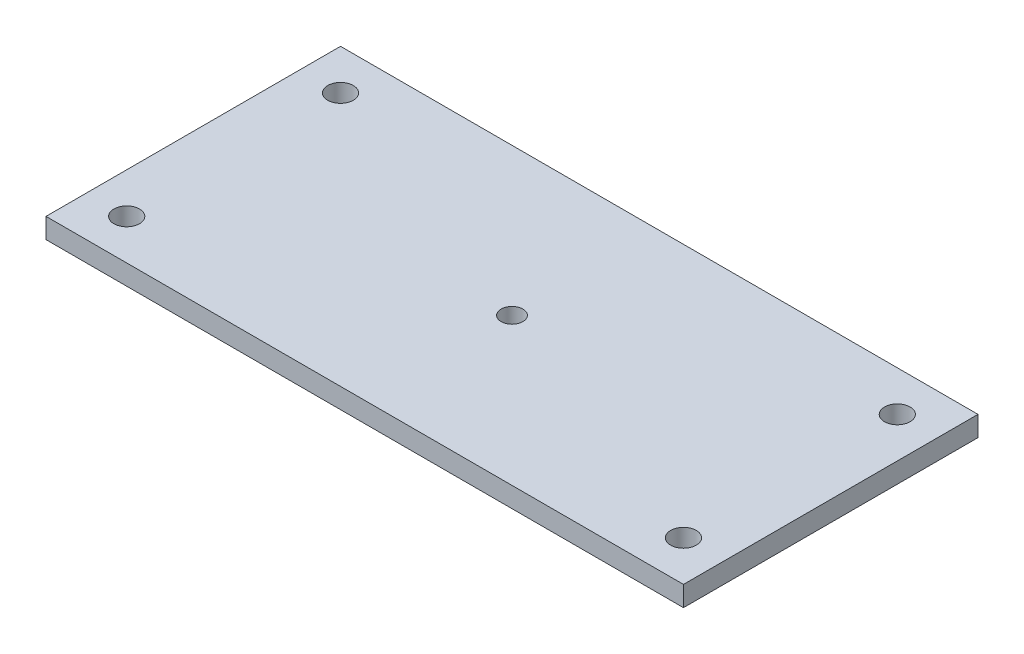
ISO-10303-21;
HEADER;
FILE_DESCRIPTION(('STEP AP214'),'2;1');
FILE_NAME('part.step','',(''),(''),'','','');
FILE_SCHEMA(('AUTOMOTIVE_DESIGN { 1 0 10303 214 1 1 1 1 }'));
ENDSEC;
DATA;
#1=APPLICATION_CONTEXT('core data for automotive mechanical design processes');
#2=APPLICATION_PROTOCOL_DEFINITION('international standard','automotive_design',2000,#1);
#3=PRODUCT_CONTEXT('',#1,'mechanical');
#4=PRODUCT('Part','Part','',(#3));
#5=PRODUCT_RELATED_PRODUCT_CATEGORY('part','',(#4));
#6=PRODUCT_DEFINITION_FORMATION('','',#4);
#7=PRODUCT_DEFINITION_CONTEXT('part definition',#1,'design');
#8=PRODUCT_DEFINITION('design','',#6,#7);
#9=PRODUCT_DEFINITION_SHAPE('','',#8);
#10=(LENGTH_UNIT() NAMED_UNIT(*) SI_UNIT(.MILLI.,.METRE.));
#11=(NAMED_UNIT(*) PLANE_ANGLE_UNIT() SI_UNIT($,.RADIAN.));
#12=(NAMED_UNIT(*) SI_UNIT($,.STERADIAN.) SOLID_ANGLE_UNIT());
#13=UNCERTAINTY_MEASURE_WITH_UNIT(LENGTH_MEASURE(1.E-05),#10,'distance_accuracy_value','');
#14=(GEOMETRIC_REPRESENTATION_CONTEXT(3) GLOBAL_UNCERTAINTY_ASSIGNED_CONTEXT((#13)) GLOBAL_UNIT_ASSIGNED_CONTEXT((#10,
#11,#12)) REPRESENTATION_CONTEXT('',''));
#15=CARTESIAN_POINT('',(0.,0.,0.));
#16=DIRECTION('',(0.,0.,1.));
#17=DIRECTION('',(1.,0.,0.));
#18=AXIS2_PLACEMENT_3D('',#15,#16,#17);
#19=CARTESIAN_POINT('',(0.,5.,0.));
#20=DIRECTION('',(1.,0.,0.));
#21=DIRECTION('',(0.,0.,-1.));
#22=AXIS2_PLACEMENT_3D('',#19,#20,#21);
#23=PLANE('',#22);
#24=DIRECTION('',(0.,0.,1.));
#25=VECTOR('',#24,1.);
#26=CARTESIAN_POINT('',(0.,0.,0.));
#27=LINE('',#26,#25);
#28=CARTESIAN_POINT('',(0.,0.,-73.));
#29=VERTEX_POINT('',#28);
#30=CARTESIAN_POINT('',(0.,0.,0.));
#31=VERTEX_POINT('',#30);
#32=EDGE_CURVE('E95',#29,#31,#27,.T.);
#33=ORIENTED_EDGE('',*,*,#32,.T.);
#34=DIRECTION('',(0.,-1.,0.));
#35=VECTOR('',#34,1.);
#36=CARTESIAN_POINT('',(0.,5.,0.));
#37=LINE('',#36,#35);
#38=CARTESIAN_POINT('',(0.,5.,0.));
#39=VERTEX_POINT('',#38);
#40=EDGE_CURVE('E11',#39,#31,#37,.T.);
#41=ORIENTED_EDGE('',*,*,#40,.F.);
#42=DIRECTION('',(0.,0.,1.));
#43=VECTOR('',#42,1.);
#44=CARTESIAN_POINT('',(0.,5.,0.));
#45=LINE('',#44,#43);
#46=CARTESIAN_POINT('',(0.,5.,-73.));
#47=VERTEX_POINT('',#46);
#48=EDGE_CURVE('E83',#47,#39,#45,.T.);
#49=ORIENTED_EDGE('',*,*,#48,.F.);
#50=DIRECTION('',(0.,-1.,0.));
#51=VECTOR('',#50,1.);
#52=CARTESIAN_POINT('',(0.,5.,-73.));
#53=LINE('',#52,#51);
#54=EDGE_CURVE('E91',#47,#29,#53,.T.);
#55=ORIENTED_EDGE('',*,*,#54,.T.);
#56=EDGE_LOOP('',(#33,#41,#49,#55));
#57=FACE_BOUND('',#56,.T.);
#58=ADVANCED_FACE('F32',(#57),#23,.F.);
#59=CARTESIAN_POINT('',(0.,5.,0.));
#60=DIRECTION('',(0.,0.,-1.));
#61=DIRECTION('',(-1.,0.,0.));
#62=AXIS2_PLACEMENT_3D('',#59,#60,#61);
#63=PLANE('',#62);
#64=DIRECTION('',(1.,0.,0.));
#65=VECTOR('',#64,1.);
#66=CARTESIAN_POINT('',(0.,0.,0.));
#67=LINE('',#66,#65);
#68=CARTESIAN_POINT('',(158.,0.,0.));
#69=VERTEX_POINT('',#68);
#70=EDGE_CURVE('E87',#31,#69,#67,.T.);
#71=ORIENTED_EDGE('',*,*,#70,.T.);
#72=DIRECTION('',(0.,-1.,0.));
#73=VECTOR('',#72,1.);
#74=CARTESIAN_POINT('',(158.,5.,0.));
#75=LINE('',#74,#73);
#76=CARTESIAN_POINT('',(158.,5.,0.));
#77=VERTEX_POINT('',#76);
#78=EDGE_CURVE('E40',#77,#69,#75,.T.);
#79=ORIENTED_EDGE('',*,*,#78,.F.);
#80=DIRECTION('',(1.,0.,0.));
#81=VECTOR('',#80,1.);
#82=CARTESIAN_POINT('',(0.,5.,0.));
#83=LINE('',#82,#81);
#84=EDGE_CURVE('E78',#39,#77,#83,.T.);
#85=ORIENTED_EDGE('',*,*,#84,.F.);
#86=ORIENTED_EDGE('',*,*,#40,.T.);
#87=EDGE_LOOP('',(#71,#79,#85,#86));
#88=FACE_BOUND('',#87,.T.);
#89=ADVANCED_FACE('F86',(#88),#63,.F.);
#90=CARTESIAN_POINT('',(158.,5.,0.));
#91=DIRECTION('',(-1.,0.,0.));
#92=DIRECTION('',(0.,0.,1.));
#93=AXIS2_PLACEMENT_3D('',#90,#91,#92);
#94=PLANE('',#93);
#95=DIRECTION('',(0.,0.,-1.));
#96=VECTOR('',#95,1.);
#97=CARTESIAN_POINT('',(158.,0.,0.));
#98=LINE('',#97,#96);
#99=CARTESIAN_POINT('',(158.,0.,-73.));
#100=VERTEX_POINT('',#99);
#101=EDGE_CURVE('E65',#69,#100,#98,.T.);
#102=ORIENTED_EDGE('',*,*,#101,.T.);
#103=DIRECTION('',(0.,-1.,0.));
#104=VECTOR('',#103,1.);
#105=CARTESIAN_POINT('',(158.,5.,-73.));
#106=LINE('',#105,#104);
#107=CARTESIAN_POINT('',(158.,5.,-73.));
#108=VERTEX_POINT('',#107);
#109=EDGE_CURVE('E88',#108,#100,#106,.T.);
#110=ORIENTED_EDGE('',*,*,#109,.F.);
#111=DIRECTION('',(0.,0.,-1.));
#112=VECTOR('',#111,1.);
#113=CARTESIAN_POINT('',(158.,5.,0.));
#114=LINE('',#113,#112);
#115=EDGE_CURVE('E81',#77,#108,#114,.T.);
#116=ORIENTED_EDGE('',*,*,#115,.F.);
#117=ORIENTED_EDGE('',*,*,#78,.T.);
#118=EDGE_LOOP('',(#102,#110,#116,#117));
#119=FACE_BOUND('',#118,.T.);
#120=ADVANCED_FACE('F89',(#119),#94,.F.);
#121=CARTESIAN_POINT('',(0.,5.,-73.));
#122=DIRECTION('',(0.,0.,1.));
#123=DIRECTION('',(1.,0.,0.));
#124=AXIS2_PLACEMENT_3D('',#121,#122,#123);
#125=PLANE('',#124);
#126=DIRECTION('',(-1.,0.,0.));
#127=VECTOR('',#126,1.);
#128=CARTESIAN_POINT('',(0.,0.,-73.));
#129=LINE('',#128,#127);
#130=EDGE_CURVE('E71',#100,#29,#129,.T.);
#131=ORIENTED_EDGE('',*,*,#130,.T.);
#132=ORIENTED_EDGE('',*,*,#54,.F.);
#133=DIRECTION('',(-1.,0.,0.));
#134=VECTOR('',#133,1.);
#135=CARTESIAN_POINT('',(0.,5.,-73.));
#136=LINE('',#135,#134);
#137=EDGE_CURVE('E48',#108,#47,#136,.T.);
#138=ORIENTED_EDGE('',*,*,#137,.F.);
#139=ORIENTED_EDGE('',*,*,#109,.T.);
#140=EDGE_LOOP('',(#131,#132,#138,#139));
#141=FACE_BOUND('',#140,.T.);
#142=ADVANCED_FACE('F103',(#141),#125,.F.);
#143=CARTESIAN_POINT('',(0.,5.,0.));
#144=DIRECTION('',(0.,-1.,0.));
#145=DIRECTION('',(0.,0.,-1.));
#146=AXIS2_PLACEMENT_3D('',#143,#144,#145);
#147=PLANE('',#146);
#148=CARTESIAN_POINT('',(79.,5.,-36.5));
#149=DIRECTION('',(0.,-1.,0.));
#150=DIRECTION('',(0.,0.,-1.));
#151=AXIS2_PLACEMENT_3D('',#148,#149,#150);
#152=CIRCLE('',#151,2.7051);
#153=CARTESIAN_POINT('',(79.,5.,-39.2051));
#154=VERTEX_POINT('',#153);
#155=EDGE_CURVE('E132',#154,#154,#152,.T.);
#156=ORIENTED_EDGE('',*,*,#155,.T.);
#157=EDGE_LOOP('',(#156));
#158=FACE_BOUND('',#157,.T.);
#159=CARTESIAN_POINT('',(10.,5.,-10.));
#160=DIRECTION('',(0.,-1.,0.));
#161=DIRECTION('',(0.,0.,-1.));
#162=AXIS2_PLACEMENT_3D('',#159,#160,#161);
#163=CIRCLE('',#162,3.175);
#164=CARTESIAN_POINT('',(10.,5.,-13.175));
#165=VERTEX_POINT('',#164);
#166=EDGE_CURVE('E126',#165,#165,#163,.T.);
#167=ORIENTED_EDGE('',*,*,#166,.T.);
#168=EDGE_LOOP('',(#167));
#169=FACE_BOUND('',#168,.T.);
#170=CARTESIAN_POINT('',(10.,5.,-63.));
#171=DIRECTION('',(0.,-1.,0.));
#172=DIRECTION('',(0.,0.,-1.));
#173=AXIS2_PLACEMENT_3D('',#170,#171,#172);
#174=CIRCLE('',#173,3.175);
#175=CARTESIAN_POINT('',(10.,5.,-66.175));
#176=VERTEX_POINT('',#175);
#177=EDGE_CURVE('E120',#176,#176,#174,.T.);
#178=ORIENTED_EDGE('',*,*,#177,.T.);
#179=EDGE_LOOP('',(#178));
#180=FACE_BOUND('',#179,.T.);
#181=CARTESIAN_POINT('',(148.,5.,-63.));
#182=DIRECTION('',(0.,-1.,0.));
#183=DIRECTION('',(0.,0.,-1.));
#184=AXIS2_PLACEMENT_3D('',#181,#182,#183);
#185=CIRCLE('',#184,3.17499999999998);
#186=CARTESIAN_POINT('',(148.,5.,-66.175));
#187=VERTEX_POINT('',#186);
#188=EDGE_CURVE('E114',#187,#187,#185,.T.);
#189=ORIENTED_EDGE('',*,*,#188,.T.);
#190=EDGE_LOOP('',(#189));
#191=FACE_BOUND('',#190,.T.);
#192=CARTESIAN_POINT('',(148.,5.,-10.));
#193=DIRECTION('',(0.,-1.,0.));
#194=DIRECTION('',(0.,0.,-1.));
#195=AXIS2_PLACEMENT_3D('',#192,#193,#194);
#196=CIRCLE('',#195,3.17499999999998);
#197=CARTESIAN_POINT('',(148.,5.,-13.175));
#198=VERTEX_POINT('',#197);
#199=EDGE_CURVE('E98',#198,#198,#196,.T.);
#200=ORIENTED_EDGE('',*,*,#199,.T.);
#201=EDGE_LOOP('',(#200));
#202=FACE_BOUND('',#201,.T.);
#203=ORIENTED_EDGE('',*,*,#48,.T.);
#204=ORIENTED_EDGE('',*,*,#84,.T.);
#205=ORIENTED_EDGE('',*,*,#115,.T.);
#206=ORIENTED_EDGE('',*,*,#137,.T.);
#207=EDGE_LOOP('',(#203,#204,#205,#206));
#208=FACE_BOUND('',#207,.T.);
#209=ADVANCED_FACE('F79',(#158,#169,#180,#191,#202,#208),#147,.F.);
#210=CARTESIAN_POINT('',(0.,0.,0.));
#211=DIRECTION('',(0.,-1.,0.));
#212=DIRECTION('',(0.,0.,-1.));
#213=AXIS2_PLACEMENT_3D('',#210,#211,#212);
#214=PLANE('',#213);
#215=CARTESIAN_POINT('',(79.,0.,-36.5));
#216=DIRECTION('',(0.,-1.,0.));
#217=DIRECTION('',(0.,0.,-1.));
#218=AXIS2_PLACEMENT_3D('',#215,#216,#217);
#219=CIRCLE('',#218,2.7051);
#220=CARTESIAN_POINT('',(79.,0.,-39.2051));
#221=VERTEX_POINT('',#220);
#222=EDGE_CURVE('E135',#221,#221,#219,.T.);
#223=ORIENTED_EDGE('',*,*,#222,.F.);
#224=EDGE_LOOP('',(#223));
#225=FACE_BOUND('',#224,.T.);
#226=CARTESIAN_POINT('',(10.,0.,-10.));
#227=DIRECTION('',(0.,-1.,0.));
#228=DIRECTION('',(0.,0.,-1.));
#229=AXIS2_PLACEMENT_3D('',#226,#227,#228);
#230=CIRCLE('',#229,3.17499999999999);
#231=CARTESIAN_POINT('',(10.,0.,-13.175));
#232=VERTEX_POINT('',#231);
#233=EDGE_CURVE('E129',#232,#232,#230,.T.);
#234=ORIENTED_EDGE('',*,*,#233,.F.);
#235=EDGE_LOOP('',(#234));
#236=FACE_BOUND('',#235,.T.);
#237=CARTESIAN_POINT('',(10.,0.,-63.));
#238=DIRECTION('',(0.,-1.,0.));
#239=DIRECTION('',(0.,0.,-1.));
#240=AXIS2_PLACEMENT_3D('',#237,#238,#239);
#241=CIRCLE('',#240,3.17499999999999);
#242=CARTESIAN_POINT('',(10.,0.,-66.175));
#243=VERTEX_POINT('',#242);
#244=EDGE_CURVE('E123',#243,#243,#241,.T.);
#245=ORIENTED_EDGE('',*,*,#244,.F.);
#246=EDGE_LOOP('',(#245));
#247=FACE_BOUND('',#246,.T.);
#248=CARTESIAN_POINT('',(148.,0.,-63.));
#249=DIRECTION('',(0.,-1.,0.));
#250=DIRECTION('',(0.,0.,-1.));
#251=AXIS2_PLACEMENT_3D('',#248,#249,#250);
#252=CIRCLE('',#251,3.17499999999998);
#253=CARTESIAN_POINT('',(148.,0.,-66.175));
#254=VERTEX_POINT('',#253);
#255=EDGE_CURVE('E117',#254,#254,#252,.T.);
#256=ORIENTED_EDGE('',*,*,#255,.F.);
#257=EDGE_LOOP('',(#256));
#258=FACE_BOUND('',#257,.T.);
#259=CARTESIAN_POINT('',(148.,0.,-10.));
#260=DIRECTION('',(0.,-1.,0.));
#261=DIRECTION('',(0.,0.,-1.));
#262=AXIS2_PLACEMENT_3D('',#259,#260,#261);
#263=CIRCLE('',#262,3.17499999999998);
#264=CARTESIAN_POINT('',(148.,0.,-13.175));
#265=VERTEX_POINT('',#264);
#266=EDGE_CURVE('E111',#265,#265,#263,.T.);
#267=ORIENTED_EDGE('',*,*,#266,.F.);
#268=EDGE_LOOP('',(#267));
#269=FACE_BOUND('',#268,.T.);
#270=ORIENTED_EDGE('',*,*,#32,.F.);
#271=ORIENTED_EDGE('',*,*,#130,.F.);
#272=ORIENTED_EDGE('',*,*,#101,.F.);
#273=ORIENTED_EDGE('',*,*,#70,.F.);
#274=EDGE_LOOP('',(#270,#271,#272,#273));
#275=FACE_BOUND('',#274,.T.);
#276=ADVANCED_FACE('F106',(#225,#236,#247,#258,#269,#275),#214,.T.);
#277=CARTESIAN_POINT('',(148.,0.,-10.));
#278=DIRECTION('',(0.,-1.,0.));
#279=DIRECTION('',(0.,0.,-1.));
#280=AXIS2_PLACEMENT_3D('',#277,#278,#279);
#281=CYLINDRICAL_SURFACE('',#280,3.17499999999998);
#282=ORIENTED_EDGE('',*,*,#199,.F.);
#283=EDGE_LOOP('',(#282));
#284=FACE_BOUND('',#283,.T.);
#285=ORIENTED_EDGE('',*,*,#266,.T.);
#286=EDGE_LOOP('',(#285));
#287=FACE_BOUND('',#286,.T.);
#288=ADVANCED_FACE('F143',(#284,#287),#281,.F.);
#289=CARTESIAN_POINT('',(148.,0.,-63.));
#290=DIRECTION('',(0.,-1.,0.));
#291=DIRECTION('',(0.,0.,-1.));
#292=AXIS2_PLACEMENT_3D('',#289,#290,#291);
#293=CYLINDRICAL_SURFACE('',#292,3.17499999999998);
#294=ORIENTED_EDGE('',*,*,#188,.F.);
#295=EDGE_LOOP('',(#294));
#296=FACE_BOUND('',#295,.T.);
#297=ORIENTED_EDGE('',*,*,#255,.T.);
#298=EDGE_LOOP('',(#297));
#299=FACE_BOUND('',#298,.T.);
#300=ADVANCED_FACE('F154',(#296,#299),#293,.F.);
#301=CARTESIAN_POINT('',(10.,0.,-63.));
#302=DIRECTION('',(0.,-1.,0.));
#303=DIRECTION('',(0.,0.,-1.));
#304=AXIS2_PLACEMENT_3D('',#301,#302,#303);
#305=CYLINDRICAL_SURFACE('',#304,3.17499999999999);
#306=ORIENTED_EDGE('',*,*,#177,.F.);
#307=EDGE_LOOP('',(#306));
#308=FACE_BOUND('',#307,.T.);
#309=ORIENTED_EDGE('',*,*,#244,.T.);
#310=EDGE_LOOP('',(#309));
#311=FACE_BOUND('',#310,.T.);
#312=ADVANCED_FACE('F160',(#308,#311),#305,.F.);
#313=CARTESIAN_POINT('',(10.,0.,-10.));
#314=DIRECTION('',(0.,-1.,0.));
#315=DIRECTION('',(0.,0.,-1.));
#316=AXIS2_PLACEMENT_3D('',#313,#314,#315);
#317=CYLINDRICAL_SURFACE('',#316,3.17499999999999);
#318=ORIENTED_EDGE('',*,*,#166,.F.);
#319=EDGE_LOOP('',(#318));
#320=FACE_BOUND('',#319,.T.);
#321=ORIENTED_EDGE('',*,*,#233,.T.);
#322=EDGE_LOOP('',(#321));
#323=FACE_BOUND('',#322,.T.);
#324=ADVANCED_FACE('F191',(#320,#323),#317,.F.);
#325=CARTESIAN_POINT('',(79.,0.,-36.5));
#326=DIRECTION('',(0.,-1.,0.));
#327=DIRECTION('',(0.,0.,-1.));
#328=AXIS2_PLACEMENT_3D('',#325,#326,#327);
#329=CYLINDRICAL_SURFACE('',#328,2.7051);
#330=ORIENTED_EDGE('',*,*,#155,.F.);
#331=EDGE_LOOP('',(#330));
#332=FACE_BOUND('',#331,.T.);
#333=ORIENTED_EDGE('',*,*,#222,.T.);
#334=EDGE_LOOP('',(#333));
#335=FACE_BOUND('',#334,.T.);
#336=ADVANCED_FACE('F139',(#332,#335),#329,.F.);
#337=CLOSED_SHELL('',(#58,#89,#120,#142,#209,#276,#288,#300,#312,#324,#336));
#338=MANIFOLD_SOLID_BREP('B2',#337);
#339=ADVANCED_BREP_SHAPE_REPRESENTATION('',(#18,#338),#14);
#340=SHAPE_DEFINITION_REPRESENTATION(#9,#339);
ENDSEC;
END-ISO-10303-21;
